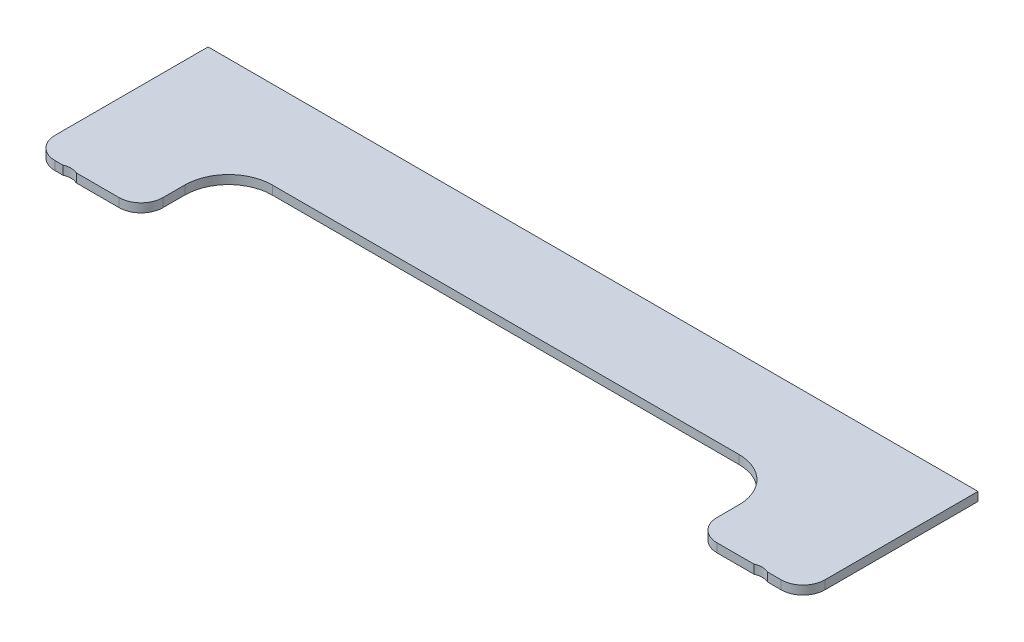
ISO-10303-21;
HEADER;
FILE_DESCRIPTION(('STEP AP214'),'2;1');
FILE_NAME('part.step','',(''),(''),'','','');
FILE_SCHEMA(('AUTOMOTIVE_DESIGN { 1 0 10303 214 1 1 1 1 }'));
ENDSEC;
DATA;
#1=APPLICATION_CONTEXT('core data for automotive mechanical design processes');
#2=APPLICATION_PROTOCOL_DEFINITION('international standard','automotive_design',2000,#1);
#3=PRODUCT_CONTEXT('',#1,'mechanical');
#4=PRODUCT('Part','Part','',(#3));
#5=PRODUCT_RELATED_PRODUCT_CATEGORY('part','',(#4));
#6=PRODUCT_DEFINITION_FORMATION('','',#4);
#7=PRODUCT_DEFINITION_CONTEXT('part definition',#1,'design');
#8=PRODUCT_DEFINITION('design','',#6,#7);
#9=PRODUCT_DEFINITION_SHAPE('','',#8);
#10=(LENGTH_UNIT() NAMED_UNIT(*) SI_UNIT(.MILLI.,.METRE.));
#11=(NAMED_UNIT(*) PLANE_ANGLE_UNIT() SI_UNIT($,.RADIAN.));
#12=(NAMED_UNIT(*) SI_UNIT($,.STERADIAN.) SOLID_ANGLE_UNIT());
#13=UNCERTAINTY_MEASURE_WITH_UNIT(LENGTH_MEASURE(1.E-05),#10,'distance_accuracy_value','');
#14=(GEOMETRIC_REPRESENTATION_CONTEXT(3) GLOBAL_UNCERTAINTY_ASSIGNED_CONTEXT((#13)) GLOBAL_UNIT_ASSIGNED_CONTEXT((#10,
#11,#12)) REPRESENTATION_CONTEXT('',''));
#15=CARTESIAN_POINT('',(0.,0.,0.));
#16=DIRECTION('',(0.,0.,1.));
#17=DIRECTION('',(1.,0.,0.));
#18=AXIS2_PLACEMENT_3D('',#15,#16,#17);
#19=CARTESIAN_POINT('',(174.797101449275,6.,0.));
#20=DIRECTION('',(0.,0.,-1.));
#21=DIRECTION('',(-1.,0.,0.));
#22=AXIS2_PLACEMENT_3D('',#19,#20,#21);
#23=PLANE('',#22);
#24=DIRECTION('',(0.,-1.,0.));
#25=VECTOR('',#24,1.);
#26=CARTESIAN_POINT('',(165.379677144264,11.,0.));
#27=LINE('',#26,#25);
#28=CARTESIAN_POINT('',(165.379677144264,0.,0.));
#29=VERTEX_POINT('',#28);
#30=CARTESIAN_POINT('',(165.379677144264,6.,0.));
#31=VERTEX_POINT('',#30);
#32=EDGE_CURVE('E158',#29,#31,#27,.F.);
#33=ORIENTED_EDGE('',*,*,#32,.F.);
#34=DIRECTION('',(1.,0.,0.));
#35=VECTOR('',#34,1.);
#36=CARTESIAN_POINT('',(174.797101449275,0.,0.));
#37=LINE('',#36,#35);
#38=CARTESIAN_POINT('',(174.797101449275,0.,0.));
#39=VERTEX_POINT('',#38);
#40=EDGE_CURVE('E167',#29,#39,#37,.T.);
#41=ORIENTED_EDGE('',*,*,#40,.T.);
#42=DIRECTION('',(0.,-1.,0.));
#43=VECTOR('',#42,1.);
#44=CARTESIAN_POINT('',(174.797101449275,6.,0.));
#45=LINE('',#44,#43);
#46=CARTESIAN_POINT('',(174.797101449275,6.,0.));
#47=VERTEX_POINT('',#46);
#48=EDGE_CURVE('E194',#47,#39,#45,.T.);
#49=ORIENTED_EDGE('',*,*,#48,.F.);
#50=DIRECTION('',(1.,0.,0.));
#51=VECTOR('',#50,1.);
#52=CARTESIAN_POINT('',(174.797101449275,6.,0.));
#53=LINE('',#52,#51);
#54=EDGE_CURVE('E169',#31,#47,#53,.T.);
#55=ORIENTED_EDGE('',*,*,#54,.F.);
#56=EDGE_LOOP('',(#33,#41,#49,#55));
#57=FACE_BOUND('',#56,.T.);
#58=ADVANCED_FACE('F35',(#57),#23,.F.);
#59=DIRECTION('',(0.,-1.,0.));
#60=VECTOR('',#59,1.);
#61=CARTESIAN_POINT('',(156.214525754288,11.,0.));
#62=LINE('',#61,#60);
#63=CARTESIAN_POINT('',(156.214525754288,6.,0.));
#64=VERTEX_POINT('',#63);
#65=CARTESIAN_POINT('',(156.214525754288,0.,0.));
#66=VERTEX_POINT('',#65);
#67=EDGE_CURVE('E50',#64,#66,#62,.T.);
#68=ORIENTED_EDGE('',*,*,#67,.F.);
#69=CARTESIAN_POINT('',(130.797101449275,6.,0.));
#70=VERTEX_POINT('',#69);
#71=EDGE_CURVE('E272',#70,#64,#53,.T.);
#72=ORIENTED_EDGE('',*,*,#71,.F.);
#73=DIRECTION('',(0.,-1.,0.));
#74=VECTOR('',#73,1.);
#75=CARTESIAN_POINT('',(130.797101449275,6.,0.));
#76=LINE('',#75,#74);
#77=CARTESIAN_POINT('',(130.797101449275,0.,0.));
#78=VERTEX_POINT('',#77);
#79=EDGE_CURVE('E196',#70,#78,#76,.T.);
#80=ORIENTED_EDGE('',*,*,#79,.T.);
#81=EDGE_CURVE('E176',#78,#66,#37,.T.);
#82=ORIENTED_EDGE('',*,*,#81,.T.);
#83=EDGE_LOOP('',(#68,#72,#80,#82));
#84=FACE_BOUND('',#83,.T.);
#85=ADVANCED_FACE('F269',(#84),#23,.F.);
#86=CARTESIAN_POINT('',(-279.202898550725,6.,0.));
#87=DIRECTION('',(0.,0.,-1.));
#88=DIRECTION('',(-1.,0.,0.));
#89=AXIS2_PLACEMENT_3D('',#86,#87,#88);
#90=PLANE('',#89);
#91=DIRECTION('',(0.,-1.,0.));
#92=VECTOR('',#91,1.);
#93=CARTESIAN_POINT('',(-308.620322855753,14.,0.));
#94=LINE('',#93,#92);
#95=CARTESIAN_POINT('',(-308.620322855753,0.,0.));
#96=VERTEX_POINT('',#95);
#97=CARTESIAN_POINT('',(-308.620322855753,6.,0.));
#98=VERTEX_POINT('',#97);
#99=EDGE_CURVE('E307',#96,#98,#94,.F.);
#100=ORIENTED_EDGE('',*,*,#99,.F.);
#101=DIRECTION('',(1.,0.,0.));
#102=VECTOR('',#101,1.);
#103=CARTESIAN_POINT('',(-279.202898550725,0.,0.));
#104=LINE('',#103,#102);
#105=CARTESIAN_POINT('',(-279.202898550725,0.,0.));
#106=VERTEX_POINT('',#105);
#107=EDGE_CURVE('E234',#96,#106,#104,.T.);
#108=ORIENTED_EDGE('',*,*,#107,.T.);
#109=DIRECTION('',(0.,-1.,0.));
#110=VECTOR('',#109,1.);
#111=CARTESIAN_POINT('',(-279.202898550725,6.,0.));
#112=LINE('',#111,#110);
#113=CARTESIAN_POINT('',(-279.202898550725,6.,0.));
#114=VERTEX_POINT('',#113);
#115=EDGE_CURVE('E217',#114,#106,#112,.T.);
#116=ORIENTED_EDGE('',*,*,#115,.F.);
#117=DIRECTION('',(1.,0.,0.));
#118=VECTOR('',#117,1.);
#119=CARTESIAN_POINT('',(-279.202898550725,6.,0.));
#120=LINE('',#119,#118);
#121=EDGE_CURVE('E317',#98,#114,#120,.T.);
#122=ORIENTED_EDGE('',*,*,#121,.F.);
#123=EDGE_LOOP('',(#100,#108,#116,#122));
#124=FACE_BOUND('',#123,.T.);
#125=ADVANCED_FACE('F355',(#124),#90,.F.);
#126=DIRECTION('',(0.,-1.,0.));
#127=VECTOR('',#126,1.);
#128=CARTESIAN_POINT('',(-317.785474245703,14.,0.));
#129=LINE('',#128,#127);
#130=CARTESIAN_POINT('',(-317.785474245703,6.,0.));
#131=VERTEX_POINT('',#130);
#132=CARTESIAN_POINT('',(-317.785474245703,0.,0.));
#133=VERTEX_POINT('',#132);
#134=EDGE_CURVE('E57',#131,#133,#129,.T.);
#135=ORIENTED_EDGE('',*,*,#134,.F.);
#136=CARTESIAN_POINT('',(-323.202898550725,6.,0.));
#137=VERTEX_POINT('',#136);
#138=EDGE_CURVE('E318',#137,#131,#120,.T.);
#139=ORIENTED_EDGE('',*,*,#138,.F.);
#140=DIRECTION('',(0.,-1.,0.));
#141=VECTOR('',#140,1.);
#142=CARTESIAN_POINT('',(-323.202898550725,6.,0.));
#143=LINE('',#142,#141);
#144=CARTESIAN_POINT('',(-323.202898550725,0.,0.));
#145=VERTEX_POINT('',#144);
#146=EDGE_CURVE('E220',#137,#145,#143,.T.);
#147=ORIENTED_EDGE('',*,*,#146,.T.);
#148=EDGE_CURVE('E232',#145,#133,#104,.T.);
#149=ORIENTED_EDGE('',*,*,#148,.T.);
#150=EDGE_LOOP('',(#135,#139,#147,#149));
#151=FACE_BOUND('',#150,.T.);
#152=ADVANCED_FACE('F237',(#151),#90,.F.);
#153=CARTESIAN_POINT('',(-338.202898550725,6.,-120.));
#154=DIRECTION('',(0.,0.,1.));
#155=DIRECTION('',(1.,0.,0.));
#156=AXIS2_PLACEMENT_3D('',#153,#154,#155);
#157=PLANE('',#156);
#158=DIRECTION('',(-1.,0.,0.));
#159=VECTOR('',#158,1.);
#160=CARTESIAN_POINT('',(-338.202898550725,0.,-120.));
#161=LINE('',#160,#159);
#162=CARTESIAN_POINT('',(189.797101449275,0.,-120.));
#163=VERTEX_POINT('',#162);
#164=CARTESIAN_POINT('',(-338.202898550725,0.,-120.));
#165=VERTEX_POINT('',#164);
#166=EDGE_CURVE('E281',#163,#165,#161,.T.);
#167=ORIENTED_EDGE('',*,*,#166,.T.);
#168=DIRECTION('',(0.,-1.,0.));
#169=VECTOR('',#168,1.);
#170=CARTESIAN_POINT('',(-338.202898550725,6.,-120.));
#171=LINE('',#170,#169);
#172=CARTESIAN_POINT('',(-338.202898550725,6.,-120.));
#173=VERTEX_POINT('',#172);
#174=EDGE_CURVE('E226',#173,#165,#171,.T.);
#175=ORIENTED_EDGE('',*,*,#174,.F.);
#176=DIRECTION('',(-1.,0.,0.));
#177=VECTOR('',#176,1.);
#178=CARTESIAN_POINT('',(-338.202898550725,6.,-120.));
#179=LINE('',#178,#177);
#180=CARTESIAN_POINT('',(189.797101449275,6.,-120.));
#181=VERTEX_POINT('',#180);
#182=EDGE_CURVE('E186',#181,#173,#179,.T.);
#183=ORIENTED_EDGE('',*,*,#182,.F.);
#184=DIRECTION('',(0.,-1.,0.));
#185=VECTOR('',#184,1.);
#186=CARTESIAN_POINT('',(189.797101449275,6.,-120.));
#187=LINE('',#186,#185);
#188=EDGE_CURVE('E187',#181,#163,#187,.T.);
#189=ORIENTED_EDGE('',*,*,#188,.T.);
#190=EDGE_LOOP('',(#167,#175,#183,#189));
#191=FACE_BOUND('',#190,.T.);
#192=ADVANCED_FACE('F37',(#191),#157,.F.);
#193=CARTESIAN_POINT('',(-338.202898550725,6.,-15.));
#194=DIRECTION('',(1.,0.,0.));
#195=DIRECTION('',(0.,0.,-1.));
#196=AXIS2_PLACEMENT_3D('',#193,#194,#195);
#197=PLANE('',#196);
#198=DIRECTION('',(0.,0.,1.));
#199=VECTOR('',#198,1.);
#200=CARTESIAN_POINT('',(-338.202898550725,0.,-15.));
#201=LINE('',#200,#199);
#202=CARTESIAN_POINT('',(-338.202898550725,0.,-15.));
#203=VERTEX_POINT('',#202);
#204=EDGE_CURVE('E283',#165,#203,#201,.T.);
#205=ORIENTED_EDGE('',*,*,#204,.T.);
#206=DIRECTION('',(0.,-1.,0.));
#207=VECTOR('',#206,1.);
#208=CARTESIAN_POINT('',(-338.202898550725,6.,-15.));
#209=LINE('',#208,#207);
#210=CARTESIAN_POINT('',(-338.202898550725,6.,-15.));
#211=VERTEX_POINT('',#210);
#212=EDGE_CURVE('E223',#211,#203,#209,.T.);
#213=ORIENTED_EDGE('',*,*,#212,.F.);
#214=DIRECTION('',(0.,0.,1.));
#215=VECTOR('',#214,1.);
#216=CARTESIAN_POINT('',(-338.202898550725,6.,-15.));
#217=LINE('',#216,#215);
#218=EDGE_CURVE('E293',#173,#211,#217,.T.);
#219=ORIENTED_EDGE('',*,*,#218,.F.);
#220=ORIENTED_EDGE('',*,*,#174,.T.);
#221=EDGE_LOOP('',(#205,#213,#219,#220));
#222=FACE_BOUND('',#221,.T.);
#223=ADVANCED_FACE('F292',(#222),#197,.F.);
#224=CARTESIAN_POINT('',(-323.202898550725,6.,-15.));
#225=DIRECTION('',(0.,-1.,0.));
#226=DIRECTION('',(0.,0.,-1.));
#227=AXIS2_PLACEMENT_3D('',#224,#225,#226);
#228=CYLINDRICAL_SURFACE('',#227,15.);
#229=CARTESIAN_POINT('',(-323.202898550725,0.,-15.));
#230=DIRECTION('',(0.,1.,0.));
#231=DIRECTION('',(0.,0.,1.));
#232=AXIS2_PLACEMENT_3D('',#229,#230,#231);
#233=CIRCLE('',#232,15.);
#234=EDGE_CURVE('E245',#203,#145,#233,.T.);
#235=ORIENTED_EDGE('',*,*,#234,.T.);
#236=ORIENTED_EDGE('',*,*,#146,.F.);
#237=CARTESIAN_POINT('',(-323.202898550725,6.,-15.));
#238=DIRECTION('',(0.,1.,0.));
#239=DIRECTION('',(0.,0.,1.));
#240=AXIS2_PLACEMENT_3D('',#237,#238,#239);
#241=CIRCLE('',#240,15.);
#242=EDGE_CURVE('E315',#211,#137,#241,.T.);
#243=ORIENTED_EDGE('',*,*,#242,.F.);
#244=ORIENTED_EDGE('',*,*,#212,.T.);
#245=EDGE_LOOP('',(#235,#236,#243,#244));
#246=FACE_BOUND('',#245,.T.);
#247=ADVANCED_FACE('F288',(#246),#228,.T.);
#248=CARTESIAN_POINT('',(-279.202898550725,6.,-15.));
#249=DIRECTION('',(0.,-1.,0.));
#250=DIRECTION('',(0.,0.,-1.));
#251=AXIS2_PLACEMENT_3D('',#248,#249,#250);
#252=CYLINDRICAL_SURFACE('',#251,15.);
#253=CARTESIAN_POINT('',(-279.202898550725,0.,-15.));
#254=DIRECTION('',(0.,1.,0.));
#255=DIRECTION('',(0.,0.,-1.));
#256=AXIS2_PLACEMENT_3D('',#253,#254,#255);
#257=CIRCLE('',#256,15.);
#258=CARTESIAN_POINT('',(-264.202898550725,0.,-15.));
#259=VERTEX_POINT('',#258);
#260=EDGE_CURVE('E241',#106,#259,#257,.T.);
#261=ORIENTED_EDGE('',*,*,#260,.T.);
#262=DIRECTION('',(0.,-1.,0.));
#263=VECTOR('',#262,1.);
#264=CARTESIAN_POINT('',(-264.202898550725,6.,-15.));
#265=LINE('',#264,#263);
#266=CARTESIAN_POINT('',(-264.202898550725,6.,-15.));
#267=VERTEX_POINT('',#266);
#268=EDGE_CURVE('E214',#267,#259,#265,.T.);
#269=ORIENTED_EDGE('',*,*,#268,.F.);
#270=CARTESIAN_POINT('',(-279.202898550725,6.,-15.));
#271=DIRECTION('',(0.,1.,0.));
#272=DIRECTION('',(0.,0.,-1.));
#273=AXIS2_PLACEMENT_3D('',#270,#271,#272);
#274=CIRCLE('',#273,15.);
#275=EDGE_CURVE('E320',#114,#267,#274,.T.);
#276=ORIENTED_EDGE('',*,*,#275,.F.);
#277=ORIENTED_EDGE('',*,*,#115,.T.);
#278=EDGE_LOOP('',(#261,#269,#276,#277));
#279=FACE_BOUND('',#278,.T.);
#280=ADVANCED_FACE('F350',(#279),#252,.T.);
#281=CARTESIAN_POINT('',(-264.202898550725,6.,-30.));
#282=DIRECTION('',(-1.,0.,0.));
#283=DIRECTION('',(0.,0.,1.));
#284=AXIS2_PLACEMENT_3D('',#281,#282,#283);
#285=PLANE('',#284);
#286=DIRECTION('',(0.,0.,-1.));
#287=VECTOR('',#286,1.);
#288=CARTESIAN_POINT('',(-264.202898550725,0.,-30.));
#289=LINE('',#288,#287);
#290=CARTESIAN_POINT('',(-264.202898550725,0.,-30.));
#291=VERTEX_POINT('',#290);
#292=EDGE_CURVE('E243',#259,#291,#289,.T.);
#293=ORIENTED_EDGE('',*,*,#292,.T.);
#294=DIRECTION('',(0.,-1.,0.));
#295=VECTOR('',#294,1.);
#296=CARTESIAN_POINT('',(-264.202898550725,6.,-30.));
#297=LINE('',#296,#295);
#298=CARTESIAN_POINT('',(-264.202898550725,6.,-30.));
#299=VERTEX_POINT('',#298);
#300=EDGE_CURVE('E211',#299,#291,#297,.T.);
#301=ORIENTED_EDGE('',*,*,#300,.F.);
#302=DIRECTION('',(0.,0.,-1.));
#303=VECTOR('',#302,1.);
#304=CARTESIAN_POINT('',(-264.202898550725,6.,-30.));
#305=LINE('',#304,#303);
#306=EDGE_CURVE('E322',#267,#299,#305,.T.);
#307=ORIENTED_EDGE('',*,*,#306,.F.);
#308=ORIENTED_EDGE('',*,*,#268,.T.);
#309=EDGE_LOOP('',(#293,#301,#307,#308));
#310=FACE_BOUND('',#309,.T.);
#311=ADVANCED_FACE('F347',(#310),#285,.F.);
#312=CARTESIAN_POINT('',(-234.202898550725,6.,-30.));
#313=DIRECTION('',(0.,-1.,0.));
#314=DIRECTION('',(0.,0.,-1.));
#315=AXIS2_PLACEMENT_3D('',#312,#313,#314);
#316=CYLINDRICAL_SURFACE('',#315,30.);
#317=CARTESIAN_POINT('',(-234.202898550725,0.,-30.));
#318=DIRECTION('',(0.,-1.,0.));
#319=DIRECTION('',(0.,0.,1.));
#320=AXIS2_PLACEMENT_3D('',#317,#318,#319);
#321=CIRCLE('',#320,30.);
#322=CARTESIAN_POINT('',(-234.202898550725,0.,-59.9999999999999));
#323=VERTEX_POINT('',#322);
#324=EDGE_CURVE('E250',#291,#323,#321,.T.);
#325=ORIENTED_EDGE('',*,*,#324,.T.);
#326=DIRECTION('',(0.,-1.,0.));
#327=VECTOR('',#326,1.);
#328=CARTESIAN_POINT('',(-234.202898550725,6.,-59.9999999999999));
#329=LINE('',#328,#327);
#330=CARTESIAN_POINT('',(-234.202898550725,6.,-59.9999999999999));
#331=VERTEX_POINT('',#330);
#332=EDGE_CURVE('E208',#331,#323,#329,.T.);
#333=ORIENTED_EDGE('',*,*,#332,.F.);
#334=CARTESIAN_POINT('',(-234.202898550725,6.,-30.));
#335=DIRECTION('',(0.,-1.,0.));
#336=DIRECTION('',(0.,0.,1.));
#337=AXIS2_PLACEMENT_3D('',#334,#335,#336);
#338=CIRCLE('',#337,30.);
#339=EDGE_CURVE('E324',#299,#331,#338,.T.);
#340=ORIENTED_EDGE('',*,*,#339,.F.);
#341=ORIENTED_EDGE('',*,*,#300,.T.);
#342=EDGE_LOOP('',(#325,#333,#340,#341));
#343=FACE_BOUND('',#342,.T.);
#344=ADVANCED_FACE('F343',(#343),#316,.F.);
#345=CARTESIAN_POINT('',(85.7971014492753,6.,-60.));
#346=DIRECTION('',(0.,0.,-1.));
#347=DIRECTION('',(-1.,0.,0.));
#348=AXIS2_PLACEMENT_3D('',#345,#346,#347);
#349=PLANE('',#348);
#350=DIRECTION('',(1.,0.,0.));
#351=VECTOR('',#350,1.);
#352=CARTESIAN_POINT('',(85.7971014492753,0.,-60.));
#353=LINE('',#352,#351);
#354=CARTESIAN_POINT('',(85.7971014492753,0.,-60.));
#355=VERTEX_POINT('',#354);
#356=EDGE_CURVE('E252',#323,#355,#353,.T.);
#357=ORIENTED_EDGE('',*,*,#356,.T.);
#358=DIRECTION('',(0.,-1.,0.));
#359=VECTOR('',#358,1.);
#360=CARTESIAN_POINT('',(85.7971014492753,6.,-60.));
#361=LINE('',#360,#359);
#362=CARTESIAN_POINT('',(85.7971014492753,6.,-60.));
#363=VERTEX_POINT('',#362);
#364=EDGE_CURVE('E205',#363,#355,#361,.T.);
#365=ORIENTED_EDGE('',*,*,#364,.F.);
#366=DIRECTION('',(1.,0.,0.));
#367=VECTOR('',#366,1.);
#368=CARTESIAN_POINT('',(85.7971014492753,6.,-60.));
#369=LINE('',#368,#367);
#370=EDGE_CURVE('E326',#331,#363,#369,.T.);
#371=ORIENTED_EDGE('',*,*,#370,.F.);
#372=ORIENTED_EDGE('',*,*,#332,.T.);
#373=EDGE_LOOP('',(#357,#365,#371,#372));
#374=FACE_BOUND('',#373,.T.);
#375=ADVANCED_FACE('F339',(#374),#349,.F.);
#376=CARTESIAN_POINT('',(85.7971014492753,6.,-30.));
#377=DIRECTION('',(0.,-1.,0.));
#378=DIRECTION('',(0.,0.,-1.));
#379=AXIS2_PLACEMENT_3D('',#376,#377,#378);
#380=CYLINDRICAL_SURFACE('',#379,30.);
#381=CARTESIAN_POINT('',(85.7971014492753,0.,-30.));
#382=DIRECTION('',(0.,-1.,0.));
#383=DIRECTION('',(0.,0.,1.));
#384=AXIS2_PLACEMENT_3D('',#381,#382,#383);
#385=CIRCLE('',#384,30.);
#386=CARTESIAN_POINT('',(115.797101449275,0.,-30.));
#387=VERTEX_POINT('',#386);
#388=EDGE_CURVE('E254',#355,#387,#385,.T.);
#389=ORIENTED_EDGE('',*,*,#388,.T.);
#390=DIRECTION('',(0.,-1.,0.));
#391=VECTOR('',#390,1.);
#392=CARTESIAN_POINT('',(115.797101449275,6.,-30.));
#393=LINE('',#392,#391);
#394=CARTESIAN_POINT('',(115.797101449275,6.,-30.));
#395=VERTEX_POINT('',#394);
#396=EDGE_CURVE('E202',#395,#387,#393,.T.);
#397=ORIENTED_EDGE('',*,*,#396,.F.);
#398=CARTESIAN_POINT('',(85.7971014492753,6.,-30.));
#399=DIRECTION('',(0.,-1.,0.));
#400=DIRECTION('',(0.,0.,1.));
#401=AXIS2_PLACEMENT_3D('',#398,#399,#400);
#402=CIRCLE('',#401,30.);
#403=EDGE_CURVE('E328',#363,#395,#402,.T.);
#404=ORIENTED_EDGE('',*,*,#403,.F.);
#405=ORIENTED_EDGE('',*,*,#364,.T.);
#406=EDGE_LOOP('',(#389,#397,#404,#405));
#407=FACE_BOUND('',#406,.T.);
#408=ADVANCED_FACE('F334',(#407),#380,.F.);
#409=CARTESIAN_POINT('',(115.797101449275,6.,-15.));
#410=DIRECTION('',(1.,0.,0.));
#411=DIRECTION('',(0.,0.,-1.));
#412=AXIS2_PLACEMENT_3D('',#409,#410,#411);
#413=PLANE('',#412);
#414=DIRECTION('',(0.,0.,1.));
#415=VECTOR('',#414,1.);
#416=CARTESIAN_POINT('',(115.797101449275,0.,-15.));
#417=LINE('',#416,#415);
#418=CARTESIAN_POINT('',(115.797101449275,0.,-15.));
#419=VERTEX_POINT('',#418);
#420=EDGE_CURVE('E179',#387,#419,#417,.T.);
#421=ORIENTED_EDGE('',*,*,#420,.T.);
#422=DIRECTION('',(0.,-1.,0.));
#423=VECTOR('',#422,1.);
#424=CARTESIAN_POINT('',(115.797101449275,6.,-15.));
#425=LINE('',#424,#423);
#426=CARTESIAN_POINT('',(115.797101449275,6.,-15.));
#427=VERTEX_POINT('',#426);
#428=EDGE_CURVE('E199',#427,#419,#425,.T.);
#429=ORIENTED_EDGE('',*,*,#428,.F.);
#430=DIRECTION('',(0.,0.,1.));
#431=VECTOR('',#430,1.);
#432=CARTESIAN_POINT('',(115.797101449275,6.,-15.));
#433=LINE('',#432,#431);
#434=EDGE_CURVE('E329',#395,#427,#433,.T.);
#435=ORIENTED_EDGE('',*,*,#434,.F.);
#436=ORIENTED_EDGE('',*,*,#396,.T.);
#437=EDGE_LOOP('',(#421,#429,#435,#436));
#438=FACE_BOUND('',#437,.T.);
#439=ADVANCED_FACE('F258',(#438),#413,.F.);
#440=CARTESIAN_POINT('',(130.797101449275,6.,-15.));
#441=DIRECTION('',(0.,-1.,0.));
#442=DIRECTION('',(0.,0.,-1.));
#443=AXIS2_PLACEMENT_3D('',#440,#441,#442);
#444=CYLINDRICAL_SURFACE('',#443,15.);
#445=CARTESIAN_POINT('',(130.797101449275,0.,-15.));
#446=DIRECTION('',(0.,1.,0.));
#447=DIRECTION('',(0.,0.,-1.));
#448=AXIS2_PLACEMENT_3D('',#445,#446,#447);
#449=CIRCLE('',#448,15.);
#450=EDGE_CURVE('E177',#419,#78,#449,.T.);
#451=ORIENTED_EDGE('',*,*,#450,.T.);
#452=ORIENTED_EDGE('',*,*,#79,.F.);
#453=CARTESIAN_POINT('',(130.797101449275,6.,-15.));
#454=DIRECTION('',(0.,1.,0.));
#455=DIRECTION('',(0.,0.,-1.));
#456=AXIS2_PLACEMENT_3D('',#453,#454,#455);
#457=CIRCLE('',#456,15.);
#458=EDGE_CURVE('E267',#427,#70,#457,.T.);
#459=ORIENTED_EDGE('',*,*,#458,.F.);
#460=ORIENTED_EDGE('',*,*,#428,.T.);
#461=EDGE_LOOP('',(#451,#452,#459,#460));
#462=FACE_BOUND('',#461,.T.);
#463=ADVANCED_FACE('F265',(#462),#444,.T.);
#464=CARTESIAN_POINT('',(174.797101449275,6.,-15.));
#465=DIRECTION('',(0.,-1.,0.));
#466=DIRECTION('',(0.,0.,-1.));
#467=AXIS2_PLACEMENT_3D('',#464,#465,#466);
#468=CYLINDRICAL_SURFACE('',#467,15.);
#469=CARTESIAN_POINT('',(174.797101449275,0.,-15.));
#470=DIRECTION('',(0.,1.,0.));
#471=DIRECTION('',(0.,0.,-1.));
#472=AXIS2_PLACEMENT_3D('',#469,#470,#471);
#473=CIRCLE('',#472,15.);
#474=CARTESIAN_POINT('',(189.797101449275,0.,-15.));
#475=VERTEX_POINT('',#474);
#476=EDGE_CURVE('E175',#39,#475,#473,.T.);
#477=ORIENTED_EDGE('',*,*,#476,.T.);
#478=DIRECTION('',(0.,-1.,0.));
#479=VECTOR('',#478,1.);
#480=CARTESIAN_POINT('',(189.797101449275,6.,-15.));
#481=LINE('',#480,#479);
#482=CARTESIAN_POINT('',(189.797101449275,6.,-15.));
#483=VERTEX_POINT('',#482);
#484=EDGE_CURVE('E190',#483,#475,#481,.T.);
#485=ORIENTED_EDGE('',*,*,#484,.F.);
#486=CARTESIAN_POINT('',(174.797101449275,6.,-15.));
#487=DIRECTION('',(0.,1.,0.));
#488=DIRECTION('',(0.,0.,-1.));
#489=AXIS2_PLACEMENT_3D('',#486,#487,#488);
#490=CIRCLE('',#489,15.);
#491=EDGE_CURVE('E274',#47,#483,#490,.T.);
#492=ORIENTED_EDGE('',*,*,#491,.F.);
#493=ORIENTED_EDGE('',*,*,#48,.T.);
#494=EDGE_LOOP('',(#477,#485,#492,#493));
#495=FACE_BOUND('',#494,.T.);
#496=ADVANCED_FACE('F304',(#495),#468,.T.);
#497=CARTESIAN_POINT('',(189.797101449275,6.,-120.));
#498=DIRECTION('',(-1.,0.,0.));
#499=DIRECTION('',(0.,0.,1.));
#500=AXIS2_PLACEMENT_3D('',#497,#498,#499);
#501=PLANE('',#500);
#502=DIRECTION('',(0.,0.,-1.));
#503=VECTOR('',#502,1.);
#504=CARTESIAN_POINT('',(189.797101449275,0.,-120.));
#505=LINE('',#504,#503);
#506=EDGE_CURVE('E184',#475,#163,#505,.T.);
#507=ORIENTED_EDGE('',*,*,#506,.T.);
#508=ORIENTED_EDGE('',*,*,#188,.F.);
#509=DIRECTION('',(0.,0.,-1.));
#510=VECTOR('',#509,1.);
#511=CARTESIAN_POINT('',(189.797101449275,6.,-120.));
#512=LINE('',#511,#510);
#513=EDGE_CURVE('E191',#483,#181,#512,.T.);
#514=ORIENTED_EDGE('',*,*,#513,.F.);
#515=ORIENTED_EDGE('',*,*,#484,.T.);
#516=EDGE_LOOP('',(#507,#508,#514,#515));
#517=FACE_BOUND('',#516,.T.);
#518=ADVANCED_FACE('F300',(#517),#501,.F.);
#519=CARTESIAN_POINT('',(174.797101449275,6.,-15.));
#520=DIRECTION('',(0.,-1.,0.));
#521=DIRECTION('',(0.,0.,-1.));
#522=AXIS2_PLACEMENT_3D('',#519,#520,#521);
#523=PLANE('',#522);
#524=CARTESIAN_POINT('',(160.797101449276,6.,9.99999999998519));
#525=DIRECTION('',(0.,-1.,0.));
#526=DIRECTION('',(0.,0.,-1.));
#527=AXIS2_PLACEMENT_3D('',#524,#525,#526);
#528=CIRCLE('',#527,11.);
#529=EDGE_CURVE('E170',#31,#64,#528,.F.);
#530=ORIENTED_EDGE('',*,*,#529,.F.);
#531=ORIENTED_EDGE('',*,*,#54,.T.);
#532=ORIENTED_EDGE('',*,*,#491,.T.);
#533=ORIENTED_EDGE('',*,*,#513,.T.);
#534=ORIENTED_EDGE('',*,*,#182,.T.);
#535=ORIENTED_EDGE('',*,*,#218,.T.);
#536=ORIENTED_EDGE('',*,*,#242,.T.);
#537=ORIENTED_EDGE('',*,*,#138,.T.);
#538=CARTESIAN_POINT('',(-313.202898550728,6.,9.99999999999113));
#539=DIRECTION('',(0.,-1.,0.));
#540=DIRECTION('',(0.,0.,-1.));
#541=AXIS2_PLACEMENT_3D('',#538,#539,#540);
#542=CIRCLE('',#541,11.);
#543=EDGE_CURVE('E284',#98,#131,#542,.F.);
#544=ORIENTED_EDGE('',*,*,#543,.F.);
#545=ORIENTED_EDGE('',*,*,#121,.T.);
#546=ORIENTED_EDGE('',*,*,#275,.T.);
#547=ORIENTED_EDGE('',*,*,#306,.T.);
#548=ORIENTED_EDGE('',*,*,#339,.T.);
#549=ORIENTED_EDGE('',*,*,#370,.T.);
#550=ORIENTED_EDGE('',*,*,#403,.T.);
#551=ORIENTED_EDGE('',*,*,#434,.T.);
#552=ORIENTED_EDGE('',*,*,#458,.T.);
#553=ORIENTED_EDGE('',*,*,#71,.T.);
#554=EDGE_LOOP('',(#530,#531,#532,#533,#534,#535,#536,#537,#544,#545,#546,#547,#548,#549,#550,
#551,#552,#553));
#555=FACE_BOUND('',#554,.T.);
#556=ADVANCED_FACE('F305',(#555),#523,.F.);
#557=CARTESIAN_POINT('',(174.797101449275,0.,-15.));
#558=DIRECTION('',(0.,-1.,0.));
#559=DIRECTION('',(0.,0.,-1.));
#560=AXIS2_PLACEMENT_3D('',#557,#558,#559);
#561=PLANE('',#560);
#562=ORIENTED_EDGE('',*,*,#40,.F.);
#563=CARTESIAN_POINT('',(160.797101449276,0.,9.99999999998519));
#564=DIRECTION('',(0.,-1.,0.));
#565=DIRECTION('',(0.,0.,-1.));
#566=AXIS2_PLACEMENT_3D('',#563,#564,#565);
#567=CIRCLE('',#566,11.);
#568=EDGE_CURVE('E11',#29,#66,#567,.F.);
#569=ORIENTED_EDGE('',*,*,#568,.T.);
#570=ORIENTED_EDGE('',*,*,#81,.F.);
#571=ORIENTED_EDGE('',*,*,#450,.F.);
#572=ORIENTED_EDGE('',*,*,#420,.F.);
#573=ORIENTED_EDGE('',*,*,#388,.F.);
#574=ORIENTED_EDGE('',*,*,#356,.F.);
#575=ORIENTED_EDGE('',*,*,#324,.F.);
#576=ORIENTED_EDGE('',*,*,#292,.F.);
#577=ORIENTED_EDGE('',*,*,#260,.F.);
#578=ORIENTED_EDGE('',*,*,#107,.F.);
#579=CARTESIAN_POINT('',(-313.202898550728,0.,9.99999999999113));
#580=DIRECTION('',(0.,-1.,0.));
#581=DIRECTION('',(0.,0.,-1.));
#582=AXIS2_PLACEMENT_3D('',#579,#580,#581);
#583=CIRCLE('',#582,11.);
#584=EDGE_CURVE('E43',#96,#133,#583,.F.);
#585=ORIENTED_EDGE('',*,*,#584,.T.);
#586=ORIENTED_EDGE('',*,*,#148,.F.);
#587=ORIENTED_EDGE('',*,*,#234,.F.);
#588=ORIENTED_EDGE('',*,*,#204,.F.);
#589=ORIENTED_EDGE('',*,*,#166,.F.);
#590=ORIENTED_EDGE('',*,*,#506,.F.);
#591=ORIENTED_EDGE('',*,*,#476,.F.);
#592=EDGE_LOOP('',(#562,#569,#570,#571,#572,#573,#574,#575,#576,#577,#578,#585,#586,#587,#588,
#589,#590,#591));
#593=FACE_BOUND('',#592,.T.);
#594=ADVANCED_FACE('F173',(#593),#561,.T.);
#595=CARTESIAN_POINT('',(-313.202898550728,14.,9.99999999999113));
#596=DIRECTION('',(0.,-1.,0.));
#597=DIRECTION('',(0.,0.,-1.));
#598=AXIS2_PLACEMENT_3D('',#595,#596,#597);
#599=CYLINDRICAL_SURFACE('',#598,11.);
#600=ORIENTED_EDGE('',*,*,#543,.T.);
#601=ORIENTED_EDGE('',*,*,#134,.T.);
#602=ORIENTED_EDGE('',*,*,#584,.F.);
#603=ORIENTED_EDGE('',*,*,#99,.T.);
#604=EDGE_LOOP('',(#600,#601,#602,#603));
#605=FACE_BOUND('',#604,.T.);
#606=ADVANCED_FACE('F357',(#605),#599,.F.);
#607=CARTESIAN_POINT('',(160.797101449276,11.,9.99999999998519));
#608=DIRECTION('',(0.,-1.,0.));
#609=DIRECTION('',(0.,0.,-1.));
#610=AXIS2_PLACEMENT_3D('',#607,#608,#609);
#611=CYLINDRICAL_SURFACE('',#610,11.);
#612=ORIENTED_EDGE('',*,*,#529,.T.);
#613=ORIENTED_EDGE('',*,*,#67,.T.);
#614=ORIENTED_EDGE('',*,*,#568,.F.);
#615=ORIENTED_EDGE('',*,*,#32,.T.);
#616=EDGE_LOOP('',(#612,#613,#614,#615));
#617=FACE_BOUND('',#616,.T.);
#618=ADVANCED_FACE('F157',(#617),#611,.F.);
#619=CLOSED_SHELL('',(#58,#85,#125,#152,#192,#223,#247,#280,#311,#344,#375,#408,#439,#463,#496,
#518,#556,#594,#606,#618));
#620=MANIFOLD_SOLID_BREP('B2',#619);
#621=ADVANCED_BREP_SHAPE_REPRESENTATION('',(#18,#620),#14);
#622=SHAPE_DEFINITION_REPRESENTATION(#9,#621);
ENDSEC;
END-ISO-10303-21;
